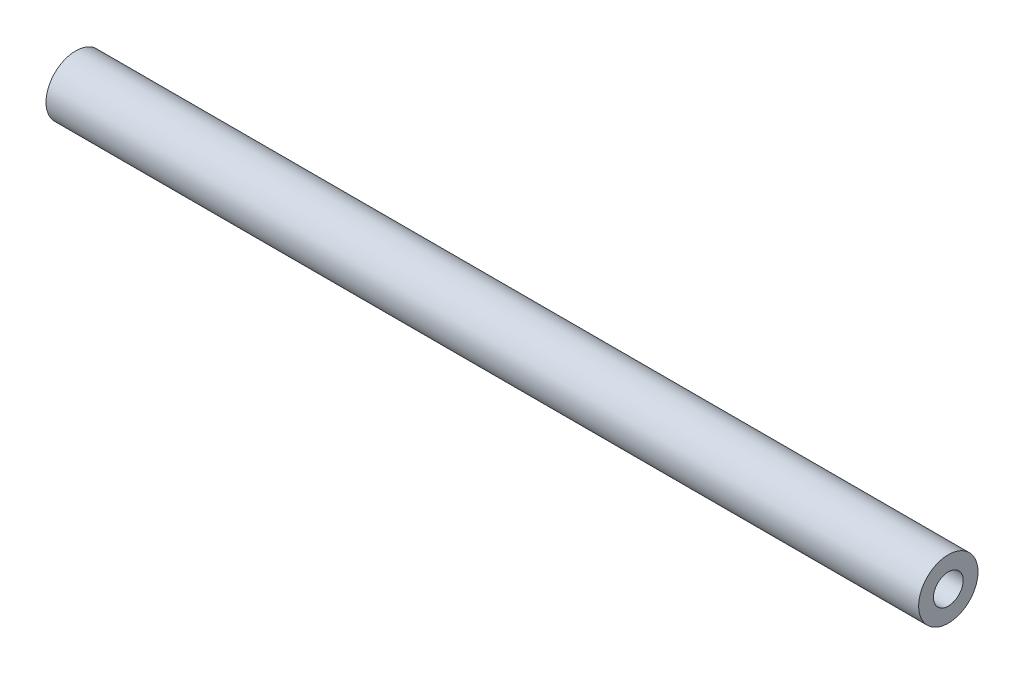
ISO-10303-21;
HEADER;
FILE_DESCRIPTION(('STEP AP214'),'2;1');
FILE_NAME('part.step','',(''),(''),'','','');
FILE_SCHEMA(('AUTOMOTIVE_DESIGN { 1 0 10303 214 1 1 1 1 }'));
ENDSEC;
DATA;
#1=APPLICATION_CONTEXT('core data for automotive mechanical design processes');
#2=APPLICATION_PROTOCOL_DEFINITION('international standard','automotive_design',2000,#1);
#3=PRODUCT_CONTEXT('',#1,'mechanical');
#4=PRODUCT('Part','Part','',(#3));
#5=PRODUCT_RELATED_PRODUCT_CATEGORY('part','',(#4));
#6=PRODUCT_DEFINITION_FORMATION('','',#4);
#7=PRODUCT_DEFINITION_CONTEXT('part definition',#1,'design');
#8=PRODUCT_DEFINITION('design','',#6,#7);
#9=PRODUCT_DEFINITION_SHAPE('','',#8);
#10=(LENGTH_UNIT() NAMED_UNIT(*) SI_UNIT(.MILLI.,.METRE.));
#11=(NAMED_UNIT(*) PLANE_ANGLE_UNIT() SI_UNIT($,.RADIAN.));
#12=(NAMED_UNIT(*) SI_UNIT($,.STERADIAN.) SOLID_ANGLE_UNIT());
#13=UNCERTAINTY_MEASURE_WITH_UNIT(LENGTH_MEASURE(1.E-05),#10,'distance_accuracy_value','');
#14=(GEOMETRIC_REPRESENTATION_CONTEXT(3) GLOBAL_UNCERTAINTY_ASSIGNED_CONTEXT((#13)) GLOBAL_UNIT_ASSIGNED_CONTEXT((#10,
#11,#12)) REPRESENTATION_CONTEXT('',''));
#15=CARTESIAN_POINT('',(0.,0.,0.));
#16=DIRECTION('',(0.,0.,1.));
#17=DIRECTION('',(1.,0.,0.));
#18=AXIS2_PLACEMENT_3D('',#15,#16,#17);
#19=CARTESIAN_POINT('',(-127.,0.,0.));
#20=DIRECTION('',(1.,0.,0.));
#21=DIRECTION('',(0.,0.,-1.));
#22=AXIS2_PLACEMENT_3D('',#19,#20,#21);
#23=CYLINDRICAL_SURFACE('',#22,10.);
#24=CARTESIAN_POINT('',(147.,0.,0.));
#25=DIRECTION('',(1.,0.,0.));
#26=DIRECTION('',(0.,0.,-1.));
#27=AXIS2_PLACEMENT_3D('',#24,#25,#26);
#28=CIRCLE('',#27,10.);
#29=CARTESIAN_POINT('',(147.,0.,-10.));
#30=VERTEX_POINT('',#29);
#31=EDGE_CURVE('E41',#30,#30,#28,.T.);
#32=ORIENTED_EDGE('',*,*,#31,.F.);
#33=EDGE_LOOP('',(#32));
#34=FACE_BOUND('',#33,.T.);
#35=CARTESIAN_POINT('',(-147.,0.,0.));
#36=DIRECTION('',(-1.,0.,0.));
#37=DIRECTION('',(0.,0.,1.));
#38=AXIS2_PLACEMENT_3D('',#35,#36,#37);
#39=CIRCLE('',#38,10.);
#40=CARTESIAN_POINT('',(-147.,0.,10.));
#41=VERTEX_POINT('',#40);
#42=EDGE_CURVE('E49',#41,#41,#39,.T.);
#43=ORIENTED_EDGE('',*,*,#42,.F.);
#44=EDGE_LOOP('',(#43));
#45=FACE_BOUND('',#44,.T.);
#46=ADVANCED_FACE('F35',(#34,#45),#23,.T.);
#47=CARTESIAN_POINT('',(147.,0.,0.));
#48=DIRECTION('',(1.,0.,0.));
#49=DIRECTION('',(0.,0.,-1.));
#50=AXIS2_PLACEMENT_3D('',#47,#48,#49);
#51=PLANE('',#50);
#52=ORIENTED_EDGE('',*,*,#31,.T.);
#53=EDGE_LOOP('',(#52));
#54=FACE_BOUND('',#53,.T.);
#55=CARTESIAN_POINT('',(147.,0.,0.));
#56=DIRECTION('',(1.,0.,0.));
#57=DIRECTION('',(0.,0.,-1.));
#58=AXIS2_PLACEMENT_3D('',#55,#56,#57);
#59=CIRCLE('',#58,5.);
#60=CARTESIAN_POINT('',(147.,0.,-5.));
#61=VERTEX_POINT('',#60);
#62=EDGE_CURVE('E45',#61,#61,#59,.T.);
#63=ORIENTED_EDGE('',*,*,#62,.F.);
#64=EDGE_LOOP('',(#63));
#65=FACE_BOUND('',#64,.T.);
#66=ADVANCED_FACE('F80',(#54,#65),#51,.T.);
#67=CARTESIAN_POINT('',(147.,0.,0.));
#68=DIRECTION('',(-1.,0.,0.));
#69=DIRECTION('',(0.,0.,1.));
#70=AXIS2_PLACEMENT_3D('',#67,#68,#69);
#71=CYLINDRICAL_SURFACE('',#70,5.);
#72=ORIENTED_EDGE('',*,*,#62,.T.);
#73=EDGE_LOOP('',(#72));
#74=FACE_BOUND('',#73,.T.);
#75=CARTESIAN_POINT('',(127.,0.,0.));
#76=DIRECTION('',(1.,0.,0.));
#77=DIRECTION('',(0.,0.,-1.));
#78=AXIS2_PLACEMENT_3D('',#75,#76,#77);
#79=CIRCLE('',#78,5.);
#80=CARTESIAN_POINT('',(127.,0.,-5.));
#81=VERTEX_POINT('',#80);
#82=EDGE_CURVE('E10',#81,#81,#79,.F.);
#83=ORIENTED_EDGE('',*,*,#82,.T.);
#84=EDGE_LOOP('',(#83));
#85=FACE_BOUND('',#84,.T.);
#86=ADVANCED_FACE('F75',(#74,#85),#71,.F.);
#87=CARTESIAN_POINT('',(127.,0.,0.));
#88=DIRECTION('',(1.,0.,0.));
#89=DIRECTION('',(0.,0.,-1.));
#90=AXIS2_PLACEMENT_3D('',#87,#88,#89);
#91=PLANE('',#90);
#92=ORIENTED_EDGE('',*,*,#82,.F.);
#93=EDGE_LOOP('',(#92));
#94=FACE_BOUND('',#93,.T.);
#95=ADVANCED_FACE('F66',(#94),#91,.T.);
#96=CARTESIAN_POINT('',(-147.,0.,0.));
#97=DIRECTION('',(-1.,0.,0.));
#98=DIRECTION('',(0.,0.,1.));
#99=AXIS2_PLACEMENT_3D('',#96,#97,#98);
#100=PLANE('',#99);
#101=ORIENTED_EDGE('',*,*,#42,.T.);
#102=EDGE_LOOP('',(#101));
#103=FACE_BOUND('',#102,.T.);
#104=CARTESIAN_POINT('',(-147.,0.,0.));
#105=DIRECTION('',(-1.,0.,0.));
#106=DIRECTION('',(0.,0.,1.));
#107=AXIS2_PLACEMENT_3D('',#104,#105,#106);
#108=CIRCLE('',#107,5.);
#109=CARTESIAN_POINT('',(-147.,0.,5.));
#110=VERTEX_POINT('',#109);
#111=EDGE_CURVE('E54',#110,#110,#108,.T.);
#112=ORIENTED_EDGE('',*,*,#111,.F.);
#113=EDGE_LOOP('',(#112));
#114=FACE_BOUND('',#113,.T.);
#115=ADVANCED_FACE('F64',(#103,#114),#100,.T.);
#116=CARTESIAN_POINT('',(-147.,0.,0.));
#117=DIRECTION('',(1.,0.,0.));
#118=DIRECTION('',(0.,0.,-1.));
#119=AXIS2_PLACEMENT_3D('',#116,#117,#118);
#120=CYLINDRICAL_SURFACE('',#119,5.);
#121=ORIENTED_EDGE('',*,*,#111,.T.);
#122=EDGE_LOOP('',(#121));
#123=FACE_BOUND('',#122,.T.);
#124=CARTESIAN_POINT('',(-127.,0.,0.));
#125=DIRECTION('',(-1.,0.,0.));
#126=DIRECTION('',(0.,0.,1.));
#127=AXIS2_PLACEMENT_3D('',#124,#125,#126);
#128=CIRCLE('',#127,5.);
#129=CARTESIAN_POINT('',(-127.,0.,5.));
#130=VERTEX_POINT('',#129);
#131=EDGE_CURVE('E55',#130,#130,#128,.T.);
#132=ORIENTED_EDGE('',*,*,#131,.F.);
#133=EDGE_LOOP('',(#132));
#134=FACE_BOUND('',#133,.T.);
#135=ADVANCED_FACE('F61',(#123,#134),#120,.F.);
#136=CARTESIAN_POINT('',(-127.,0.,0.));
#137=DIRECTION('',(1.,0.,0.));
#138=DIRECTION('',(0.,0.,-1.));
#139=AXIS2_PLACEMENT_3D('',#136,#137,#138);
#140=PLANE('',#139);
#141=ORIENTED_EDGE('',*,*,#131,.T.);
#142=EDGE_LOOP('',(#141));
#143=FACE_BOUND('',#142,.T.);
#144=ADVANCED_FACE('F73',(#143),#140,.F.);
#145=CLOSED_SHELL('',(#46,#66,#86,#95,#115,#135,#144));
#146=MANIFOLD_SOLID_BREP('B2',#145);
#147=ADVANCED_BREP_SHAPE_REPRESENTATION('',(#18,#146),#14);
#148=SHAPE_DEFINITION_REPRESENTATION(#9,#147);
ENDSEC;
END-ISO-10303-21;
